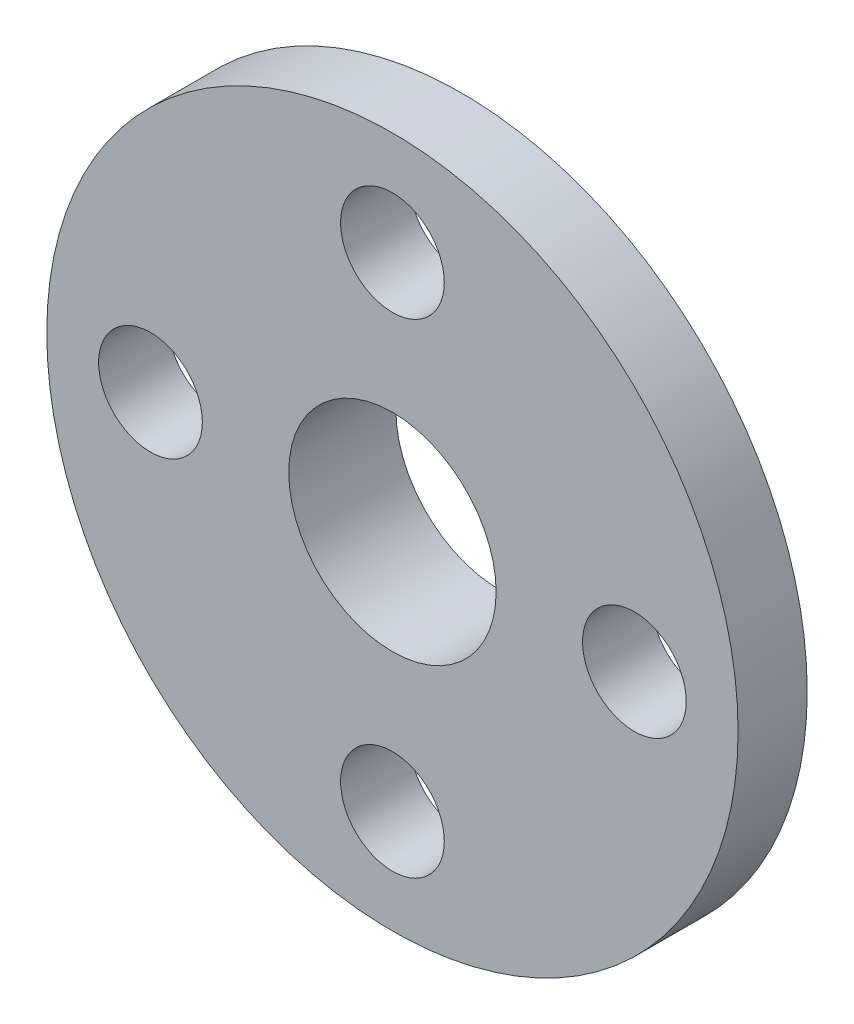
ISO-10303-21;
HEADER;
FILE_DESCRIPTION(('STEP AP214'),'2;1');
FILE_NAME('part.step','',(''),(''),'','','');
FILE_SCHEMA(('AUTOMOTIVE_DESIGN { 1 0 10303 214 1 1 1 1 }'));
ENDSEC;
DATA;
#1=APPLICATION_CONTEXT('core data for automotive mechanical design processes');
#2=APPLICATION_PROTOCOL_DEFINITION('international standard','automotive_design',2000,#1);
#3=PRODUCT_CONTEXT('',#1,'mechanical');
#4=PRODUCT('Part','Part','',(#3));
#5=PRODUCT_RELATED_PRODUCT_CATEGORY('part','',(#4));
#6=PRODUCT_DEFINITION_FORMATION('','',#4);
#7=PRODUCT_DEFINITION_CONTEXT('part definition',#1,'design');
#8=PRODUCT_DEFINITION('design','',#6,#7);
#9=PRODUCT_DEFINITION_SHAPE('','',#8);
#10=(LENGTH_UNIT() NAMED_UNIT(*) SI_UNIT(.MILLI.,.METRE.));
#11=(NAMED_UNIT(*) PLANE_ANGLE_UNIT() SI_UNIT($,.RADIAN.));
#12=(NAMED_UNIT(*) SI_UNIT($,.STERADIAN.) SOLID_ANGLE_UNIT());
#13=UNCERTAINTY_MEASURE_WITH_UNIT(LENGTH_MEASURE(1.E-05),#10,'distance_accuracy_value','');
#14=(GEOMETRIC_REPRESENTATION_CONTEXT(3) GLOBAL_UNCERTAINTY_ASSIGNED_CONTEXT((#13)) GLOBAL_UNIT_ASSIGNED_CONTEXT((#10,
#11,#12)) REPRESENTATION_CONTEXT('',''));
#15=CARTESIAN_POINT('',(0.,0.,0.));
#16=DIRECTION('',(0.,0.,1.));
#17=DIRECTION('',(1.,0.,0.));
#18=AXIS2_PLACEMENT_3D('',#15,#16,#17);
#19=CARTESIAN_POINT('',(0.,0.,0.));
#20=DIRECTION('',(0.,0.,1.));
#21=DIRECTION('',(1.,0.,0.));
#22=AXIS2_PLACEMENT_3D('',#19,#20,#21);
#23=PLANE('',#22);
#24=CARTESIAN_POINT('',(0.,-7.,0.));
#25=DIRECTION('',(0.,0.,1.));
#26=DIRECTION('',(1.,0.,0.));
#27=AXIS2_PLACEMENT_3D('',#24,#25,#26);
#28=CIRCLE('',#27,1.5);
#29=CARTESIAN_POINT('',(1.5,-7.,0.));
#30=VERTEX_POINT('',#29);
#31=EDGE_CURVE('E71',#30,#30,#28,.T.);
#32=ORIENTED_EDGE('',*,*,#31,.T.);
#33=EDGE_LOOP('',(#32));
#34=FACE_BOUND('',#33,.T.);
#35=CARTESIAN_POINT('',(0.,7.,0.));
#36=DIRECTION('',(0.,0.,1.));
#37=DIRECTION('',(1.,0.,0.));
#38=AXIS2_PLACEMENT_3D('',#35,#36,#37);
#39=CIRCLE('',#38,1.5);
#40=CARTESIAN_POINT('',(1.5,7.,0.));
#41=VERTEX_POINT('',#40);
#42=EDGE_CURVE('E65',#41,#41,#39,.T.);
#43=ORIENTED_EDGE('',*,*,#42,.T.);
#44=EDGE_LOOP('',(#43));
#45=FACE_BOUND('',#44,.T.);
#46=CARTESIAN_POINT('',(7.,0.,0.));
#47=DIRECTION('',(0.,0.,1.));
#48=DIRECTION('',(1.,0.,0.));
#49=AXIS2_PLACEMENT_3D('',#46,#47,#48);
#50=CIRCLE('',#49,1.5);
#51=CARTESIAN_POINT('',(8.5,0.,0.));
#52=VERTEX_POINT('',#51);
#53=EDGE_CURVE('E59',#52,#52,#50,.T.);
#54=ORIENTED_EDGE('',*,*,#53,.T.);
#55=EDGE_LOOP('',(#54));
#56=FACE_BOUND('',#55,.T.);
#57=CARTESIAN_POINT('',(-7.,0.,0.));
#58=DIRECTION('',(0.,0.,1.));
#59=DIRECTION('',(1.,0.,0.));
#60=AXIS2_PLACEMENT_3D('',#57,#58,#59);
#61=CIRCLE('',#60,1.5);
#62=CARTESIAN_POINT('',(-5.5,0.,0.));
#63=VERTEX_POINT('',#62);
#64=EDGE_CURVE('E53',#63,#63,#61,.T.);
#65=ORIENTED_EDGE('',*,*,#64,.T.);
#66=EDGE_LOOP('',(#65));
#67=FACE_BOUND('',#66,.T.);
#68=CARTESIAN_POINT('',(0.,0.,0.));
#69=DIRECTION('',(0.,0.,1.));
#70=DIRECTION('',(1.,0.,0.));
#71=AXIS2_PLACEMENT_3D('',#68,#69,#70);
#72=CIRCLE('',#71,10.);
#73=CARTESIAN_POINT('',(10.,0.,0.));
#74=VERTEX_POINT('',#73);
#75=EDGE_CURVE('E43',#74,#74,#72,.T.);
#76=ORIENTED_EDGE('',*,*,#75,.F.);
#77=EDGE_LOOP('',(#76));
#78=FACE_BOUND('',#77,.T.);
#79=CARTESIAN_POINT('',(0.,0.,0.));
#80=DIRECTION('',(0.,0.,1.));
#81=DIRECTION('',(1.,0.,0.));
#82=AXIS2_PLACEMENT_3D('',#79,#80,#81);
#83=CIRCLE('',#82,4.5);
#84=CARTESIAN_POINT('',(4.5,0.,0.));
#85=VERTEX_POINT('',#84);
#86=EDGE_CURVE('E10',#85,#85,#83,.F.);
#87=ORIENTED_EDGE('',*,*,#86,.F.);
#88=EDGE_LOOP('',(#87));
#89=FACE_BOUND('',#88,.T.);
#90=ADVANCED_FACE('F32',(#34,#45,#56,#67,#78,#89),#23,.F.);
#91=CARTESIAN_POINT('',(0.,0.,2.));
#92=DIRECTION('',(0.,0.,1.));
#93=DIRECTION('',(1.,0.,0.));
#94=AXIS2_PLACEMENT_3D('',#91,#92,#93);
#95=PLANE('',#94);
#96=CARTESIAN_POINT('',(0.,7.,2.));
#97=DIRECTION('',(0.,0.,1.));
#98=DIRECTION('',(1.,0.,0.));
#99=AXIS2_PLACEMENT_3D('',#96,#97,#98);
#100=CIRCLE('',#99,1.5);
#101=CARTESIAN_POINT('',(1.5,7.,2.));
#102=VERTEX_POINT('',#101);
#103=EDGE_CURVE('E62',#102,#102,#100,.T.);
#104=ORIENTED_EDGE('',*,*,#103,.F.);
#105=EDGE_LOOP('',(#104));
#106=FACE_BOUND('',#105,.T.);
#107=CARTESIAN_POINT('',(-7.,0.,2.));
#108=DIRECTION('',(0.,0.,1.));
#109=DIRECTION('',(1.,0.,0.));
#110=AXIS2_PLACEMENT_3D('',#107,#108,#109);
#111=CIRCLE('',#110,1.5);
#112=CARTESIAN_POINT('',(-5.5,0.,2.));
#113=VERTEX_POINT('',#112);
#114=EDGE_CURVE('E52',#113,#113,#111,.T.);
#115=ORIENTED_EDGE('',*,*,#114,.F.);
#116=EDGE_LOOP('',(#115));
#117=FACE_BOUND('',#116,.T.);
#118=CARTESIAN_POINT('',(0.,0.,2.));
#119=DIRECTION('',(0.,0.,1.));
#120=DIRECTION('',(1.,0.,0.));
#121=AXIS2_PLACEMENT_3D('',#118,#119,#120);
#122=CIRCLE('',#121,10.);
#123=CARTESIAN_POINT('',(10.,0.,2.));
#124=VERTEX_POINT('',#123);
#125=EDGE_CURVE('E39',#124,#124,#122,.T.);
#126=ORIENTED_EDGE('',*,*,#125,.T.);
#127=EDGE_LOOP('',(#126));
#128=FACE_BOUND('',#127,.T.);
#129=CARTESIAN_POINT('',(0.,0.,2.));
#130=DIRECTION('',(0.,0.,1.));
#131=DIRECTION('',(1.,0.,0.));
#132=AXIS2_PLACEMENT_3D('',#129,#130,#131);
#133=CIRCLE('',#132,3.);
#134=CARTESIAN_POINT('',(3.,0.,2.));
#135=VERTEX_POINT('',#134);
#136=EDGE_CURVE('E48',#135,#135,#133,.T.);
#137=ORIENTED_EDGE('',*,*,#136,.F.);
#138=EDGE_LOOP('',(#137));
#139=FACE_BOUND('',#138,.T.);
#140=CARTESIAN_POINT('',(7.,0.,2.));
#141=DIRECTION('',(0.,0.,1.));
#142=DIRECTION('',(1.,0.,0.));
#143=AXIS2_PLACEMENT_3D('',#140,#141,#142);
#144=CIRCLE('',#143,1.5);
#145=CARTESIAN_POINT('',(8.5,0.,2.));
#146=VERTEX_POINT('',#145);
#147=EDGE_CURVE('E56',#146,#146,#144,.T.);
#148=ORIENTED_EDGE('',*,*,#147,.F.);
#149=EDGE_LOOP('',(#148));
#150=FACE_BOUND('',#149,.T.);
#151=CARTESIAN_POINT('',(0.,-7.,2.));
#152=DIRECTION('',(0.,0.,1.));
#153=DIRECTION('',(1.,0.,0.));
#154=AXIS2_PLACEMENT_3D('',#151,#152,#153);
#155=CIRCLE('',#154,1.5);
#156=CARTESIAN_POINT('',(1.5,-7.,2.));
#157=VERTEX_POINT('',#156);
#158=EDGE_CURVE('E68',#157,#157,#155,.T.);
#159=ORIENTED_EDGE('',*,*,#158,.F.);
#160=EDGE_LOOP('',(#159));
#161=FACE_BOUND('',#160,.T.);
#162=ADVANCED_FACE('F101',(#106,#117,#128,#139,#150,#161),#95,.T.);
#163=CARTESIAN_POINT('',(0.,0.,2.));
#164=DIRECTION('',(0.,0.,-1.));
#165=DIRECTION('',(-1.,0.,0.));
#166=AXIS2_PLACEMENT_3D('',#163,#164,#165);
#167=CYLINDRICAL_SURFACE('',#166,10.);
#168=ORIENTED_EDGE('',*,*,#125,.F.);
#169=EDGE_LOOP('',(#168));
#170=FACE_BOUND('',#169,.T.);
#171=ORIENTED_EDGE('',*,*,#75,.T.);
#172=EDGE_LOOP('',(#171));
#173=FACE_BOUND('',#172,.T.);
#174=ADVANCED_FACE('F34',(#170,#173),#167,.T.);
#175=CARTESIAN_POINT('',(0.,0.,2.));
#176=DIRECTION('',(0.,0.,-1.));
#177=DIRECTION('',(-1.,0.,0.));
#178=AXIS2_PLACEMENT_3D('',#175,#176,#177);
#179=CYLINDRICAL_SURFACE('',#178,3.);
#180=ORIENTED_EDGE('',*,*,#136,.T.);
#181=EDGE_LOOP('',(#180));
#182=FACE_BOUND('',#181,.T.);
#183=CARTESIAN_POINT('',(0.,0.,-1.1));
#184=DIRECTION('',(0.,0.,-1.));
#185=DIRECTION('',(-1.,0.,0.));
#186=AXIS2_PLACEMENT_3D('',#183,#184,#185);
#187=CIRCLE('',#186,3.);
#188=CARTESIAN_POINT('',(-3.,0.,-1.1));
#189=VERTEX_POINT('',#188);
#190=EDGE_CURVE('E79',#189,#189,#187,.T.);
#191=ORIENTED_EDGE('',*,*,#190,.T.);
#192=EDGE_LOOP('',(#191));
#193=FACE_BOUND('',#192,.T.);
#194=ADVANCED_FACE('F83',(#182,#193),#179,.F.);
#195=CARTESIAN_POINT('',(-7.,0.,2.));
#196=DIRECTION('',(0.,0.,-1.));
#197=DIRECTION('',(-1.,0.,0.));
#198=AXIS2_PLACEMENT_3D('',#195,#196,#197);
#199=CYLINDRICAL_SURFACE('',#198,1.5);
#200=ORIENTED_EDGE('',*,*,#114,.T.);
#201=EDGE_LOOP('',(#200));
#202=FACE_BOUND('',#201,.T.);
#203=ORIENTED_EDGE('',*,*,#64,.F.);
#204=EDGE_LOOP('',(#203));
#205=FACE_BOUND('',#204,.T.);
#206=ADVANCED_FACE('F112',(#202,#205),#199,.F.);
#207=CARTESIAN_POINT('',(7.,0.,2.));
#208=DIRECTION('',(0.,0.,-1.));
#209=DIRECTION('',(-1.,0.,0.));
#210=AXIS2_PLACEMENT_3D('',#207,#208,#209);
#211=CYLINDRICAL_SURFACE('',#210,1.5);
#212=ORIENTED_EDGE('',*,*,#147,.T.);
#213=EDGE_LOOP('',(#212));
#214=FACE_BOUND('',#213,.T.);
#215=ORIENTED_EDGE('',*,*,#53,.F.);
#216=EDGE_LOOP('',(#215));
#217=FACE_BOUND('',#216,.T.);
#218=ADVANCED_FACE('F116',(#214,#217),#211,.F.);
#219=CARTESIAN_POINT('',(0.,7.,2.));
#220=DIRECTION('',(0.,0.,-1.));
#221=DIRECTION('',(-1.,0.,0.));
#222=AXIS2_PLACEMENT_3D('',#219,#220,#221);
#223=CYLINDRICAL_SURFACE('',#222,1.5);
#224=ORIENTED_EDGE('',*,*,#103,.T.);
#225=EDGE_LOOP('',(#224));
#226=FACE_BOUND('',#225,.T.);
#227=ORIENTED_EDGE('',*,*,#42,.F.);
#228=EDGE_LOOP('',(#227));
#229=FACE_BOUND('',#228,.T.);
#230=ADVANCED_FACE('F97',(#226,#229),#223,.F.);
#231=CARTESIAN_POINT('',(0.,-7.,2.));
#232=DIRECTION('',(0.,0.,-1.));
#233=DIRECTION('',(-1.,0.,0.));
#234=AXIS2_PLACEMENT_3D('',#231,#232,#233);
#235=CYLINDRICAL_SURFACE('',#234,1.5);
#236=ORIENTED_EDGE('',*,*,#158,.T.);
#237=EDGE_LOOP('',(#236));
#238=FACE_BOUND('',#237,.T.);
#239=ORIENTED_EDGE('',*,*,#31,.F.);
#240=EDGE_LOOP('',(#239));
#241=FACE_BOUND('',#240,.T.);
#242=ADVANCED_FACE('F88',(#238,#241),#235,.F.);
#243=CARTESIAN_POINT('',(0.,0.,-1.1));
#244=DIRECTION('',(0.,0.,-1.));
#245=DIRECTION('',(-1.,0.,0.));
#246=AXIS2_PLACEMENT_3D('',#243,#244,#245);
#247=PLANE('',#246);
#248=CARTESIAN_POINT('',(0.,0.,-1.1));
#249=DIRECTION('',(0.,0.,-1.));
#250=DIRECTION('',(-1.,0.,0.));
#251=AXIS2_PLACEMENT_3D('',#248,#249,#250);
#252=CIRCLE('',#251,4.5);
#253=CARTESIAN_POINT('',(-4.5,0.,-1.1));
#254=VERTEX_POINT('',#253);
#255=EDGE_CURVE('E74',#254,#254,#252,.T.);
#256=ORIENTED_EDGE('',*,*,#255,.T.);
#257=EDGE_LOOP('',(#256));
#258=FACE_BOUND('',#257,.T.);
#259=ORIENTED_EDGE('',*,*,#190,.F.);
#260=EDGE_LOOP('',(#259));
#261=FACE_BOUND('',#260,.T.);
#262=ADVANCED_FACE('F85',(#258,#261),#247,.T.);
#263=CARTESIAN_POINT('',(0.,0.,-1.1));
#264=DIRECTION('',(0.,0.,1.));
#265=DIRECTION('',(1.,0.,0.));
#266=AXIS2_PLACEMENT_3D('',#263,#264,#265);
#267=CYLINDRICAL_SURFACE('',#266,4.5);
#268=ORIENTED_EDGE('',*,*,#255,.F.);
#269=EDGE_LOOP('',(#268));
#270=FACE_BOUND('',#269,.T.);
#271=ORIENTED_EDGE('',*,*,#86,.T.);
#272=EDGE_LOOP('',(#271));
#273=FACE_BOUND('',#272,.T.);
#274=ADVANCED_FACE('F87',(#270,#273),#267,.T.);
#275=CLOSED_SHELL('',(#90,#162,#174,#194,#206,#218,#230,#242,#262,#274));
#276=MANIFOLD_SOLID_BREP('B2',#275);
#277=ADVANCED_BREP_SHAPE_REPRESENTATION('',(#18,#276),#14);
#278=SHAPE_DEFINITION_REPRESENTATION(#9,#277);
ENDSEC;
END-ISO-10303-21;
